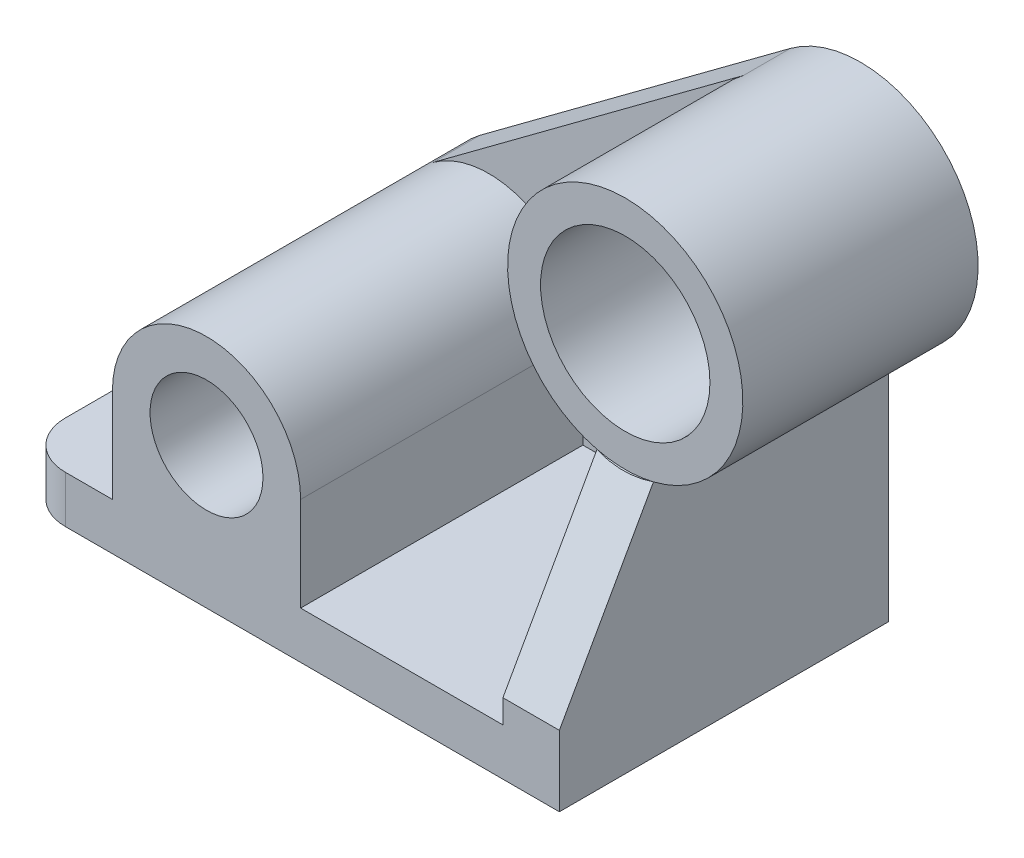
ISO-10303-21;
HEADER;
FILE_DESCRIPTION(('STEP AP214'),'2;1');
FILE_NAME('part.step','',(''),(''),'','','');
FILE_SCHEMA(('AUTOMOTIVE_DESIGN { 1 0 10303 214 1 1 1 1 }'));
ENDSEC;
DATA;
#1=APPLICATION_CONTEXT('core data for automotive mechanical design processes');
#2=APPLICATION_PROTOCOL_DEFINITION('international standard','automotive_design',2000,#1);
#3=PRODUCT_CONTEXT('',#1,'mechanical');
#4=PRODUCT('Part','Part','',(#3));
#5=PRODUCT_RELATED_PRODUCT_CATEGORY('part','',(#4));
#6=PRODUCT_DEFINITION_FORMATION('','',#4);
#7=PRODUCT_DEFINITION_CONTEXT('part definition',#1,'design');
#8=PRODUCT_DEFINITION('design','',#6,#7);
#9=PRODUCT_DEFINITION_SHAPE('','',#8);
#10=(LENGTH_UNIT() NAMED_UNIT(*) SI_UNIT(.MILLI.,.METRE.));
#11=(NAMED_UNIT(*) PLANE_ANGLE_UNIT() SI_UNIT($,.RADIAN.));
#12=(NAMED_UNIT(*) SI_UNIT($,.STERADIAN.) SOLID_ANGLE_UNIT());
#13=UNCERTAINTY_MEASURE_WITH_UNIT(LENGTH_MEASURE(1.E-05),#10,'distance_accuracy_value','');
#14=(GEOMETRIC_REPRESENTATION_CONTEXT(3) GLOBAL_UNCERTAINTY_ASSIGNED_CONTEXT((#13)) GLOBAL_UNIT_ASSIGNED_CONTEXT((#10,
#11,#12)) REPRESENTATION_CONTEXT('',''));
#15=CARTESIAN_POINT('',(0.,0.,0.));
#16=DIRECTION('',(0.,0.,1.));
#17=DIRECTION('',(1.,0.,0.));
#18=AXIS2_PLACEMENT_3D('',#15,#16,#17);
#19=CARTESIAN_POINT('',(41.0531732418524,48.5758064516129,35.));
#20=DIRECTION('',(0.,0.,-1.));
#21=DIRECTION('',(-1.,0.,0.));
#22=AXIS2_PLACEMENT_3D('',#19,#20,#21);
#23=CYLINDRICAL_SURFACE('',#22,25.);
#24=CARTESIAN_POINT('',(41.0531732418524,48.5758064516129,15.));
#25=DIRECTION('',(0.,0.,1.));
#26=DIRECTION('',(1.,0.,0.));
#27=AXIS2_PLACEMENT_3D('',#24,#25,#26);
#28=CIRCLE('',#27,25.);
#29=CARTESIAN_POINT('',(47.0531732418524,24.3064842525897,15.));
#30=VERTEX_POINT('',#29);
#31=CARTESIAN_POINT('',(35.0531732418524,24.3064842525897,15.));
#32=VERTEX_POINT('',#31);
#33=EDGE_CURVE('E537',#30,#32,#28,.T.);
#34=ORIENTED_EDGE('',*,*,#33,.F.);
#35=DIRECTION('',(0.,0.,-1.));
#36=VECTOR('',#35,1.);
#37=CARTESIAN_POINT('',(47.0531732418524,24.3064842525897,35.));
#38=LINE('',#37,#36);
#39=CARTESIAN_POINT('',(47.0531732418524,24.3064842525897,-35.));
#40=VERTEX_POINT('',#39);
#41=EDGE_CURVE('E239',#30,#40,#38,.T.);
#42=ORIENTED_EDGE('',*,*,#41,.T.);
#43=CARTESIAN_POINT('',(41.0531732418524,48.5758064516129,-35.));
#44=DIRECTION('',(0.,0.,1.));
#45=DIRECTION('',(1.,0.,0.));
#46=AXIS2_PLACEMENT_3D('',#43,#44,#45);
#47=CIRCLE('',#46,25.);
#48=CARTESIAN_POINT('',(26.1506588338031,68.6485507661774,-35.));
#49=VERTEX_POINT('',#48);
#50=EDGE_CURVE('E299',#40,#49,#47,.T.);
#51=ORIENTED_EDGE('',*,*,#50,.T.);
#52=DIRECTION('',(0.,0.,-1.));
#53=VECTOR('',#52,1.);
#54=CARTESIAN_POINT('',(26.1506588338031,68.6485507661774,-25.));
#55=LINE('',#54,#53);
#56=CARTESIAN_POINT('',(26.1506588338031,68.6485507661774,-25.));
#57=VERTEX_POINT('',#56);
#58=EDGE_CURVE('E562',#57,#49,#55,.T.);
#59=ORIENTED_EDGE('',*,*,#58,.F.);
#60=CARTESIAN_POINT('',(41.0531732418524,48.5758064516129,-25.));
#61=DIRECTION('',(0.,0.,-1.));
#62=DIRECTION('',(-1.,0.,0.));
#63=AXIS2_PLACEMENT_3D('',#60,#61,#62);
#64=CIRCLE('',#63,25.);
#65=CARTESIAN_POINT('',(35.0531732418524,24.3064842525897,-25.));
#66=VERTEX_POINT('',#65);
#67=EDGE_CURVE('E547',#66,#57,#64,.T.);
#68=ORIENTED_EDGE('',*,*,#67,.F.);
#69=DIRECTION('',(0.,0.,-1.));
#70=VECTOR('',#69,1.);
#71=CARTESIAN_POINT('',(35.0531732418524,24.3064842525897,35.));
#72=LINE('',#71,#70);
#73=EDGE_CURVE('E278',#32,#66,#72,.T.);
#74=ORIENTED_EDGE('',*,*,#73,.F.);
#75=EDGE_LOOP('',(#34,#42,#51,#59,#68,#74));
#76=FACE_BOUND('',#75,.T.);
#77=ADVANCED_FACE('F122',(#76),#23,.T.);
#78=CARTESIAN_POINT('',(41.0531732418524,48.5758064516129,35.));
#79=DIRECTION('',(0.,0.,-1.));
#80=DIRECTION('',(-1.,0.,0.));
#81=AXIS2_PLACEMENT_3D('',#78,#79,#80);
#82=CYLINDRICAL_SURFACE('',#81,18.);
#83=CARTESIAN_POINT('',(41.0531732418524,48.5758064516129,-35.));
#84=DIRECTION('',(0.,0.,1.));
#85=DIRECTION('',(1.,0.,0.));
#86=AXIS2_PLACEMENT_3D('',#83,#84,#85);
#87=CIRCLE('',#86,18.);
#88=CARTESIAN_POINT('',(59.0531732418524,48.5758064516129,-35.));
#89=VERTEX_POINT('',#88);
#90=EDGE_CURVE('E296',#89,#89,#87,.T.);
#91=ORIENTED_EDGE('',*,*,#90,.F.);
#92=EDGE_LOOP('',(#91));
#93=FACE_BOUND('',#92,.T.);
#94=CARTESIAN_POINT('',(41.0531732418524,48.5758064516129,15.));
#95=DIRECTION('',(0.,0.,1.));
#96=DIRECTION('',(1.,0.,0.));
#97=AXIS2_PLACEMENT_3D('',#94,#95,#96);
#98=CIRCLE('',#97,18.);
#99=CARTESIAN_POINT('',(59.0531732418524,48.5758064516129,15.));
#100=VERTEX_POINT('',#99);
#101=EDGE_CURVE('E535',#100,#100,#98,.F.);
#102=ORIENTED_EDGE('',*,*,#101,.F.);
#103=EDGE_LOOP('',(#102));
#104=FACE_BOUND('',#103,.T.);
#105=ADVANCED_FACE('F339',(#93,#104),#82,.F.);
#106=CARTESIAN_POINT('',(-7.94682675814757,0.,35.));
#107=DIRECTION('',(1.,0.,0.));
#108=DIRECTION('',(0.,0.,-1.));
#109=AXIS2_PLACEMENT_3D('',#106,#107,#108);
#110=PLANE('',#109);
#111=DIRECTION('',(0.,0.,-1.));
#112=VECTOR('',#111,1.);
#113=CARTESIAN_POINT('',(-7.94682675814757,-16.4241935483871,35.));
#114=LINE('',#113,#112);
#115=CARTESIAN_POINT('',(-7.94682675814757,-16.4241935483871,35.));
#116=VERTEX_POINT('',#115);
#117=CARTESIAN_POINT('',(-7.94682675814757,-16.4241935483871,-25.));
#118=VERTEX_POINT('',#117);
#119=EDGE_CURVE('E254',#116,#118,#114,.T.);
#120=ORIENTED_EDGE('',*,*,#119,.T.);
#121=DIRECTION('',(0.,-1.,0.));
#122=VECTOR('',#121,1.);
#123=CARTESIAN_POINT('',(-7.94682675814757,0.,-25.));
#124=LINE('',#123,#122);
#125=CARTESIAN_POINT('',(-7.94682675814757,3.57580645161291,-25.));
#126=VERTEX_POINT('',#125);
#127=EDGE_CURVE('E556',#126,#118,#124,.T.);
#128=ORIENTED_EDGE('',*,*,#127,.F.);
#129=DIRECTION('',(0.,0.,-1.));
#130=VECTOR('',#129,1.);
#131=CARTESIAN_POINT('',(-7.94682675814757,3.57580645161291,35.));
#132=LINE('',#131,#130);
#133=CARTESIAN_POINT('',(-7.94682675814757,3.57580645161291,35.));
#134=VERTEX_POINT('',#133);
#135=EDGE_CURVE('E292',#134,#126,#132,.T.);
#136=ORIENTED_EDGE('',*,*,#135,.F.);
#137=DIRECTION('',(0.,-1.,0.));
#138=VECTOR('',#137,1.);
#139=CARTESIAN_POINT('',(-7.94682675814757,0.,35.));
#140=LINE('',#139,#138);
#141=EDGE_CURVE('E272',#134,#116,#140,.T.);
#142=ORIENTED_EDGE('',*,*,#141,.T.);
#143=EDGE_LOOP('',(#120,#128,#136,#142));
#144=FACE_BOUND('',#143,.T.);
#145=ADVANCED_FACE('F344',(#144),#110,.T.);
#146=CARTESIAN_POINT('',(0.,-16.4241935483871,35.));
#147=DIRECTION('',(0.,1.,0.));
#148=DIRECTION('',(0.,0.,1.));
#149=AXIS2_PLACEMENT_3D('',#146,#147,#148);
#150=PLANE('',#149);
#151=DIRECTION('',(0.,0.,-1.));
#152=VECTOR('',#151,1.);
#153=CARTESIAN_POINT('',(35.0531732418524,-16.4241935483871,35.));
#154=LINE('',#153,#152);
#155=CARTESIAN_POINT('',(35.0531732418524,-16.4241935483871,35.));
#156=VERTEX_POINT('',#155);
#157=CARTESIAN_POINT('',(35.0531732418524,-16.4241935483871,-25.));
#158=VERTEX_POINT('',#157);
#159=EDGE_CURVE('E275',#156,#158,#154,.T.);
#160=ORIENTED_EDGE('',*,*,#159,.T.);
#161=DIRECTION('',(1.,0.,0.));
#162=VECTOR('',#161,1.);
#163=CARTESIAN_POINT('',(0.,-16.4241935483871,-25.));
#164=LINE('',#163,#162);
#165=EDGE_CURVE('E553',#118,#158,#164,.T.);
#166=ORIENTED_EDGE('',*,*,#165,.F.);
#167=ORIENTED_EDGE('',*,*,#119,.F.);
#168=DIRECTION('',(1.,0.,0.));
#169=VECTOR('',#168,1.);
#170=CARTESIAN_POINT('',(0.,-16.4241935483871,35.));
#171=LINE('',#170,#169);
#172=EDGE_CURVE('E246',#116,#156,#171,.T.);
#173=ORIENTED_EDGE('',*,*,#172,.T.);
#174=EDGE_LOOP('',(#160,#166,#167,#173));
#175=FACE_BOUND('',#174,.T.);
#176=ADVANCED_FACE('F351',(#175),#150,.T.);
#177=CARTESIAN_POINT('',(35.0531732418524,0.,35.));
#178=DIRECTION('',(-1.,0.,0.));
#179=DIRECTION('',(0.,0.,1.));
#180=AXIS2_PLACEMENT_3D('',#177,#178,#179);
#181=PLANE('',#180);
#182=DIRECTION('',(0.,-0.872601569326431,0.488432698750862));
#183=VECTOR('',#182,1.);
#184=CARTESIAN_POINT('',(35.0531732418524,-2.72542988397371,30.1309271473291));
#185=LINE('',#184,#183);
#186=CARTESIAN_POINT('',(35.0531732418524,-11.4241935483871,35.));
#187=VERTEX_POINT('',#186);
#188=EDGE_CURVE('E227',#32,#187,#185,.T.);
#189=ORIENTED_EDGE('',*,*,#188,.F.);
#190=ORIENTED_EDGE('',*,*,#73,.T.);
#191=DIRECTION('',(0.,1.,0.));
#192=VECTOR('',#191,1.);
#193=CARTESIAN_POINT('',(35.0531732418524,0.,-25.));
#194=LINE('',#193,#192);
#195=EDGE_CURVE('E550',#158,#66,#194,.T.);
#196=ORIENTED_EDGE('',*,*,#195,.F.);
#197=ORIENTED_EDGE('',*,*,#159,.F.);
#198=DIRECTION('',(0.,1.,0.));
#199=VECTOR('',#198,1.);
#200=CARTESIAN_POINT('',(35.0531732418524,0.,35.));
#201=LINE('',#200,#199);
#202=EDGE_CURVE('E244',#156,#187,#201,.T.);
#203=ORIENTED_EDGE('',*,*,#202,.T.);
#204=EDGE_LOOP('',(#189,#190,#196,#197,#203));
#205=FACE_BOUND('',#204,.T.);
#206=ADVANCED_FACE('F370',(#205),#181,.T.);
#207=CARTESIAN_POINT('',(-27.9468267581476,3.57580645161291,35.));
#208=DIRECTION('',(0.,0.,-1.));
#209=DIRECTION('',(-1.,0.,0.));
#210=AXIS2_PLACEMENT_3D('',#207,#208,#209);
#211=CYLINDRICAL_SURFACE('',#210,12.);
#212=CARTESIAN_POINT('',(-27.9468267581476,3.57580645161291,35.));
#213=DIRECTION('',(0.,0.,1.));
#214=DIRECTION('',(1.,0.,0.));
#215=AXIS2_PLACEMENT_3D('',#212,#213,#214);
#216=CIRCLE('',#215,12.);
#217=CARTESIAN_POINT('',(-15.9468267581476,3.57580645161291,35.));
#218=VERTEX_POINT('',#217);
#219=EDGE_CURVE('E258',#218,#218,#216,.T.);
#220=ORIENTED_EDGE('',*,*,#219,.T.);
#221=EDGE_LOOP('',(#220));
#222=FACE_BOUND('',#221,.T.);
#223=CARTESIAN_POINT('',(-27.9468267581476,3.57580645161291,-35.));
#224=DIRECTION('',(0.,0.,1.));
#225=DIRECTION('',(1.,0.,0.));
#226=AXIS2_PLACEMENT_3D('',#223,#224,#225);
#227=CIRCLE('',#226,12.);
#228=CARTESIAN_POINT('',(-15.9468267581476,3.57580645161291,-35.));
#229=VERTEX_POINT('',#228);
#230=EDGE_CURVE('E302',#229,#229,#227,.T.);
#231=ORIENTED_EDGE('',*,*,#230,.F.);
#232=EDGE_LOOP('',(#231));
#233=FACE_BOUND('',#232,.T.);
#234=ADVANCED_FACE('F357',(#222,#233),#211,.F.);
#235=CARTESIAN_POINT('',(-27.9468267581476,3.57580645161291,35.));
#236=DIRECTION('',(0.,0.,-1.));
#237=DIRECTION('',(-1.,0.,0.));
#238=AXIS2_PLACEMENT_3D('',#235,#236,#237);
#239=CYLINDRICAL_SURFACE('',#238,20.);
#240=CARTESIAN_POINT('',(-27.9468267581476,3.57580645161291,-25.));
#241=DIRECTION('',(0.,0.,-1.));
#242=DIRECTION('',(-1.,0.,0.));
#243=AXIS2_PLACEMENT_3D('',#240,#241,#242);
#244=CIRCLE('',#243,20.);
#245=CARTESIAN_POINT('',(-39.868838284587,19.6340019032645,-25.));
#246=VERTEX_POINT('',#245);
#247=EDGE_CURVE('E559',#246,#126,#244,.T.);
#248=ORIENTED_EDGE('',*,*,#247,.F.);
#249=DIRECTION('',(0.,0.,-1.));
#250=VECTOR('',#249,1.);
#251=CARTESIAN_POINT('',(-39.868838284587,19.6340019032645,-25.));
#252=LINE('',#251,#250);
#253=CARTESIAN_POINT('',(-39.868838284587,19.6340019032645,-35.));
#254=VERTEX_POINT('',#253);
#255=EDGE_CURVE('E300',#246,#254,#252,.T.);
#256=ORIENTED_EDGE('',*,*,#255,.T.);
#257=CARTESIAN_POINT('',(-27.9468267581476,3.57580645161291,-35.));
#258=DIRECTION('',(0.,0.,1.));
#259=DIRECTION('',(1.,0.,0.));
#260=AXIS2_PLACEMENT_3D('',#257,#258,#259);
#261=CIRCLE('',#260,20.);
#262=CARTESIAN_POINT('',(-47.9468267581476,3.57580645161291,-35.));
#263=VERTEX_POINT('',#262);
#264=EDGE_CURVE('E255',#254,#263,#261,.T.);
#265=ORIENTED_EDGE('',*,*,#264,.T.);
#266=DIRECTION('',(0.,0.,-1.));
#267=VECTOR('',#266,1.);
#268=CARTESIAN_POINT('',(-47.9468267581476,3.57580645161291,35.));
#269=LINE('',#268,#267);
#270=CARTESIAN_POINT('',(-47.9468267581476,3.57580645161291,35.));
#271=VERTEX_POINT('',#270);
#272=EDGE_CURVE('E289',#271,#263,#269,.T.);
#273=ORIENTED_EDGE('',*,*,#272,.F.);
#274=CARTESIAN_POINT('',(-27.9468267581476,3.57580645161291,35.));
#275=DIRECTION('',(0.,0.,1.));
#276=DIRECTION('',(1.,0.,0.));
#277=AXIS2_PLACEMENT_3D('',#274,#275,#276);
#278=CIRCLE('',#277,20.);
#279=EDGE_CURVE('E574',#134,#271,#278,.T.);
#280=ORIENTED_EDGE('',*,*,#279,.F.);
#281=ORIENTED_EDGE('',*,*,#135,.T.);
#282=EDGE_LOOP('',(#248,#256,#265,#273,#280,#281));
#283=FACE_BOUND('',#282,.T.);
#284=ADVANCED_FACE('F353',(#283),#239,.T.);
#285=CARTESIAN_POINT('',(-47.9468267581476,0.,35.));
#286=DIRECTION('',(1.,0.,0.));
#287=DIRECTION('',(0.,0.,-1.));
#288=AXIS2_PLACEMENT_3D('',#285,#286,#287);
#289=PLANE('',#288);
#290=DIRECTION('',(0.,-1.,0.));
#291=VECTOR('',#290,1.);
#292=CARTESIAN_POINT('',(-47.9468267581476,0.,-35.));
#293=LINE('',#292,#291);
#294=CARTESIAN_POINT('',(-47.9468267581476,-16.4241935483871,-35.));
#295=VERTEX_POINT('',#294);
#296=EDGE_CURVE('E257',#263,#295,#293,.T.);
#297=ORIENTED_EDGE('',*,*,#296,.T.);
#298=DIRECTION('',(0.,0.,-1.));
#299=VECTOR('',#298,1.);
#300=CARTESIAN_POINT('',(-47.9468267581476,-16.4241935483871,35.));
#301=LINE('',#300,#299);
#302=CARTESIAN_POINT('',(-47.9468267581476,-16.4241935483871,35.));
#303=VERTEX_POINT('',#302);
#304=EDGE_CURVE('E287',#303,#295,#301,.T.);
#305=ORIENTED_EDGE('',*,*,#304,.F.);
#306=DIRECTION('',(0.,-1.,0.));
#307=VECTOR('',#306,1.);
#308=CARTESIAN_POINT('',(-47.9468267581476,0.,35.));
#309=LINE('',#308,#307);
#310=EDGE_CURVE('E576',#271,#303,#309,.T.);
#311=ORIENTED_EDGE('',*,*,#310,.F.);
#312=ORIENTED_EDGE('',*,*,#272,.T.);
#313=EDGE_LOOP('',(#297,#305,#311,#312));
#314=FACE_BOUND('',#313,.T.);
#315=ADVANCED_FACE('F356',(#314),#289,.F.);
#316=CARTESIAN_POINT('',(0.,-16.4241935483871,35.));
#317=DIRECTION('',(0.,1.,0.));
#318=DIRECTION('',(0.,0.,1.));
#319=AXIS2_PLACEMENT_3D('',#316,#317,#318);
#320=PLANE('',#319);
#321=DIRECTION('',(0.,0.,-1.));
#322=VECTOR('',#321,1.);
#323=CARTESIAN_POINT('',(-67.9468267581476,-16.4241935483871,35.));
#324=LINE('',#323,#322);
#325=CARTESIAN_POINT('',(-67.9468267581476,-16.4241935483871,25.));
#326=VERTEX_POINT('',#325);
#327=CARTESIAN_POINT('',(-67.9468267581476,-16.4241935483871,-35.));
#328=VERTEX_POINT('',#327);
#329=EDGE_CURVE('E285',#326,#328,#324,.T.);
#330=ORIENTED_EDGE('',*,*,#329,.F.);
#331=CARTESIAN_POINT('',(-57.9468267581476,-16.4241935483871,25.));
#332=DIRECTION('',(0.,1.,0.));
#333=DIRECTION('',(0.,0.,1.));
#334=AXIS2_PLACEMENT_3D('',#331,#332,#333);
#335=CIRCLE('',#334,10.);
#336=CARTESIAN_POINT('',(-57.9468267581476,-16.4241935483871,35.));
#337=VERTEX_POINT('',#336);
#338=EDGE_CURVE('E144',#326,#337,#335,.T.);
#339=ORIENTED_EDGE('',*,*,#338,.T.);
#340=DIRECTION('',(1.,0.,0.));
#341=VECTOR('',#340,1.);
#342=CARTESIAN_POINT('',(0.,-16.4241935483871,35.));
#343=LINE('',#342,#341);
#344=EDGE_CURVE('E248',#337,#303,#343,.T.);
#345=ORIENTED_EDGE('',*,*,#344,.T.);
#346=ORIENTED_EDGE('',*,*,#304,.T.);
#347=DIRECTION('',(1.,0.,0.));
#348=VECTOR('',#347,1.);
#349=CARTESIAN_POINT('',(0.,-16.4241935483871,-35.));
#350=LINE('',#349,#348);
#351=EDGE_CURVE('E261',#328,#295,#350,.T.);
#352=ORIENTED_EDGE('',*,*,#351,.F.);
#353=EDGE_LOOP('',(#330,#339,#345,#346,#352));
#354=FACE_BOUND('',#353,.T.);
#355=ADVANCED_FACE('F313',(#354),#320,.T.);
#356=CARTESIAN_POINT('',(-67.9468267581476,0.,35.));
#357=DIRECTION('',(-1.,0.,0.));
#358=DIRECTION('',(0.,0.,1.));
#359=AXIS2_PLACEMENT_3D('',#356,#357,#358);
#360=PLANE('',#359);
#361=DIRECTION('',(0.,0.,-1.));
#362=VECTOR('',#361,1.);
#363=CARTESIAN_POINT('',(-67.9468267581476,-26.4241935483871,35.));
#364=LINE('',#363,#362);
#365=CARTESIAN_POINT('',(-67.9468267581476,-26.4241935483871,25.));
#366=VERTEX_POINT('',#365);
#367=CARTESIAN_POINT('',(-67.9468267581476,-26.4241935483871,-35.));
#368=VERTEX_POINT('',#367);
#369=EDGE_CURVE('E283',#366,#368,#364,.T.);
#370=ORIENTED_EDGE('',*,*,#369,.F.);
#371=DIRECTION('',(0.,1.,0.));
#372=VECTOR('',#371,1.);
#373=CARTESIAN_POINT('',(-67.9468267581476,0.,25.));
#374=LINE('',#373,#372);
#375=EDGE_CURVE('E295',#366,#326,#374,.T.);
#376=ORIENTED_EDGE('',*,*,#375,.T.);
#377=ORIENTED_EDGE('',*,*,#329,.T.);
#378=DIRECTION('',(0.,1.,0.));
#379=VECTOR('',#378,1.);
#380=CARTESIAN_POINT('',(-67.9468267581476,0.,-35.));
#381=LINE('',#380,#379);
#382=EDGE_CURVE('E264',#368,#328,#381,.T.);
#383=ORIENTED_EDGE('',*,*,#382,.F.);
#384=EDGE_LOOP('',(#370,#376,#377,#383));
#385=FACE_BOUND('',#384,.T.);
#386=ADVANCED_FACE('F308',(#385),#360,.T.);
#387=CARTESIAN_POINT('',(0.,-26.4241935483871,35.));
#388=DIRECTION('',(0.,-1.,0.));
#389=DIRECTION('',(0.,0.,-1.));
#390=AXIS2_PLACEMENT_3D('',#387,#388,#389);
#391=PLANE('',#390);
#392=DIRECTION('',(-1.,0.,0.));
#393=VECTOR('',#392,1.);
#394=CARTESIAN_POINT('',(0.,-26.4241935483871,35.));
#395=LINE('',#394,#393);
#396=CARTESIAN_POINT('',(47.0531732418524,-26.4241935483871,35.));
#397=VERTEX_POINT('',#396);
#398=CARTESIAN_POINT('',(-57.9468267581476,-26.4241935483871,35.));
#399=VERTEX_POINT('',#398);
#400=EDGE_CURVE('E243',#397,#399,#395,.T.);
#401=ORIENTED_EDGE('',*,*,#400,.T.);
#402=CARTESIAN_POINT('',(-57.9468267581476,-26.4241935483871,25.));
#403=DIRECTION('',(0.,-1.,0.));
#404=DIRECTION('',(0.,0.,-1.));
#405=AXIS2_PLACEMENT_3D('',#402,#403,#404);
#406=CIRCLE('',#405,10.);
#407=EDGE_CURVE('E12',#399,#366,#406,.T.);
#408=ORIENTED_EDGE('',*,*,#407,.T.);
#409=ORIENTED_EDGE('',*,*,#369,.T.);
#410=DIRECTION('',(-1.,0.,0.));
#411=VECTOR('',#410,1.);
#412=CARTESIAN_POINT('',(0.,-26.4241935483871,-35.));
#413=LINE('',#412,#411);
#414=CARTESIAN_POINT('',(47.0531732418524,-26.4241935483871,-35.));
#415=VERTEX_POINT('',#414);
#416=EDGE_CURVE('E267',#415,#368,#413,.T.);
#417=ORIENTED_EDGE('',*,*,#416,.F.);
#418=DIRECTION('',(0.,0.,-1.));
#419=VECTOR('',#418,1.);
#420=CARTESIAN_POINT('',(47.0531732418524,-26.4241935483871,35.));
#421=LINE('',#420,#419);
#422=EDGE_CURVE('E281',#397,#415,#421,.T.);
#423=ORIENTED_EDGE('',*,*,#422,.F.);
#424=EDGE_LOOP('',(#401,#408,#409,#417,#423));
#425=FACE_BOUND('',#424,.T.);
#426=ADVANCED_FACE('F324',(#425),#391,.T.);
#427=CARTESIAN_POINT('',(47.0531732418524,0.,35.));
#428=DIRECTION('',(-1.,0.,0.));
#429=DIRECTION('',(0.,0.,1.));
#430=AXIS2_PLACEMENT_3D('',#427,#428,#429);
#431=PLANE('',#430);
#432=ORIENTED_EDGE('',*,*,#41,.F.);
#433=DIRECTION('',(0.,0.872601569326431,-0.488432698750862));
#434=VECTOR('',#433,1.);
#435=CARTESIAN_POINT('',(47.0531732418524,12.1918199964384,21.7810996050123));
#436=LINE('',#435,#434);
#437=CARTESIAN_POINT('',(47.0531732418524,-11.4241935483871,35.));
#438=VERTEX_POINT('',#437);
#439=EDGE_CURVE('E224',#438,#30,#436,.T.);
#440=ORIENTED_EDGE('',*,*,#439,.F.);
#441=DIRECTION('',(0.,1.,0.));
#442=VECTOR('',#441,1.);
#443=CARTESIAN_POINT('',(47.0531732418524,0.,35.));
#444=LINE('',#443,#442);
#445=EDGE_CURVE('E237',#397,#438,#444,.T.);
#446=ORIENTED_EDGE('',*,*,#445,.F.);
#447=ORIENTED_EDGE('',*,*,#422,.T.);
#448=DIRECTION('',(0.,1.,0.));
#449=VECTOR('',#448,1.);
#450=CARTESIAN_POINT('',(47.0531732418524,0.,-35.));
#451=LINE('',#450,#449);
#452=EDGE_CURVE('E270',#415,#40,#451,.T.);
#453=ORIENTED_EDGE('',*,*,#452,.T.);
#454=EDGE_LOOP('',(#432,#440,#446,#447,#453));
#455=FACE_BOUND('',#454,.T.);
#456=ADVANCED_FACE('F236',(#455),#431,.F.);
#457=CARTESIAN_POINT('',(0.,0.,35.));
#458=DIRECTION('',(0.,0.,1.));
#459=DIRECTION('',(1.,0.,0.));
#460=AXIS2_PLACEMENT_3D('',#457,#458,#459);
#461=PLANE('',#460);
#462=DIRECTION('',(1.,0.,0.));
#463=VECTOR('',#462,1.);
#464=CARTESIAN_POINT('',(27.0531732418524,-11.4241935483871,35.));
#465=LINE('',#464,#463);
#466=EDGE_CURVE('E221',#187,#438,#465,.T.);
#467=ORIENTED_EDGE('',*,*,#466,.F.);
#468=ORIENTED_EDGE('',*,*,#202,.F.);
#469=ORIENTED_EDGE('',*,*,#172,.F.);
#470=ORIENTED_EDGE('',*,*,#141,.F.);
#471=ORIENTED_EDGE('',*,*,#279,.T.);
#472=ORIENTED_EDGE('',*,*,#310,.T.);
#473=ORIENTED_EDGE('',*,*,#344,.F.);
#474=DIRECTION('',(0.,1.,0.));
#475=VECTOR('',#474,1.);
#476=CARTESIAN_POINT('',(-57.9468267581476,0.,35.));
#477=LINE('',#476,#475);
#478=EDGE_CURVE('E130',#337,#399,#477,.F.);
#479=ORIENTED_EDGE('',*,*,#478,.T.);
#480=ORIENTED_EDGE('',*,*,#400,.F.);
#481=ORIENTED_EDGE('',*,*,#445,.T.);
#482=EDGE_LOOP('',(#467,#468,#469,#470,#471,#472,#473,#479,#480,#481));
#483=FACE_BOUND('',#482,.T.);
#484=ORIENTED_EDGE('',*,*,#219,.F.);
#485=EDGE_LOOP('',(#484));
#486=FACE_BOUND('',#485,.T.);
#487=ADVANCED_FACE('F241',(#483,#486),#461,.T.);
#488=CARTESIAN_POINT('',(0.,0.,-35.));
#489=DIRECTION('',(0.,0.,1.));
#490=DIRECTION('',(1.,0.,0.));
#491=AXIS2_PLACEMENT_3D('',#488,#489,#490);
#492=PLANE('',#491);
#493=ORIENTED_EDGE('',*,*,#264,.F.);
#494=DIRECTION('',(-0.802909772582581,-0.596100576321973,0.));
#495=VECTOR('',#494,1.);
#496=CARTESIAN_POINT('',(-23.5639568101859,31.7391593887556,-35.));
#497=LINE('',#496,#495);
#498=EDGE_CURVE('E543',#49,#254,#497,.T.);
#499=ORIENTED_EDGE('',*,*,#498,.F.);
#500=ORIENTED_EDGE('',*,*,#50,.F.);
#501=ORIENTED_EDGE('',*,*,#452,.F.);
#502=ORIENTED_EDGE('',*,*,#416,.T.);
#503=ORIENTED_EDGE('',*,*,#382,.T.);
#504=ORIENTED_EDGE('',*,*,#351,.T.);
#505=ORIENTED_EDGE('',*,*,#296,.F.);
#506=EDGE_LOOP('',(#493,#499,#500,#501,#502,#503,#504,#505));
#507=FACE_BOUND('',#506,.T.);
#508=ORIENTED_EDGE('',*,*,#230,.T.);
#509=EDGE_LOOP('',(#508));
#510=FACE_BOUND('',#509,.T.);
#511=ORIENTED_EDGE('',*,*,#90,.T.);
#512=EDGE_LOOP('',(#511));
#513=FACE_BOUND('',#512,.T.);
#514=ADVANCED_FACE('F318',(#507,#510,#513),#492,.F.);
#515=CARTESIAN_POINT('',(-23.5639568101859,31.7391593887556,-25.));
#516=DIRECTION('',(0.596100576321973,-0.802909772582581,0.));
#517=DIRECTION('',(0.802909772582581,0.596100576321973,0.));
#518=AXIS2_PLACEMENT_3D('',#515,#516,#517);
#519=PLANE('',#518);
#520=ORIENTED_EDGE('',*,*,#498,.T.);
#521=ORIENTED_EDGE('',*,*,#255,.F.);
#522=DIRECTION('',(-0.802909772582581,-0.596100576321973,0.));
#523=VECTOR('',#522,1.);
#524=CARTESIAN_POINT('',(-23.5639568101859,31.7391593887556,-25.));
#525=LINE('',#524,#523);
#526=EDGE_CURVE('E544',#57,#246,#525,.T.);
#527=ORIENTED_EDGE('',*,*,#526,.F.);
#528=ORIENTED_EDGE('',*,*,#58,.T.);
#529=EDGE_LOOP('',(#520,#521,#527,#528));
#530=FACE_BOUND('',#529,.T.);
#531=ADVANCED_FACE('F335',(#530),#519,.F.);
#532=CARTESIAN_POINT('',(0.,0.,-25.));
#533=DIRECTION('',(0.,0.,-1.));
#534=DIRECTION('',(-1.,0.,0.));
#535=AXIS2_PLACEMENT_3D('',#532,#533,#534);
#536=PLANE('',#535);
#537=ORIENTED_EDGE('',*,*,#526,.T.);
#538=ORIENTED_EDGE('',*,*,#247,.T.);
#539=ORIENTED_EDGE('',*,*,#127,.T.);
#540=ORIENTED_EDGE('',*,*,#165,.T.);
#541=ORIENTED_EDGE('',*,*,#195,.T.);
#542=ORIENTED_EDGE('',*,*,#67,.T.);
#543=EDGE_LOOP('',(#537,#538,#539,#540,#541,#542));
#544=FACE_BOUND('',#543,.T.);
#545=ADVANCED_FACE('F327',(#544),#536,.F.);
#546=CARTESIAN_POINT('',(-57.9468267581476,0.,25.));
#547=DIRECTION('',(0.,1.,0.));
#548=DIRECTION('',(0.,0.,1.));
#549=AXIS2_PLACEMENT_3D('',#546,#547,#548);
#550=CYLINDRICAL_SURFACE('',#549,10.);
#551=ORIENTED_EDGE('',*,*,#407,.F.);
#552=ORIENTED_EDGE('',*,*,#478,.F.);
#553=ORIENTED_EDGE('',*,*,#338,.F.);
#554=ORIENTED_EDGE('',*,*,#375,.F.);
#555=EDGE_LOOP('',(#551,#552,#553,#554));
#556=FACE_BOUND('',#555,.T.);
#557=ADVANCED_FACE('F124',(#556),#550,.T.);
#558=CARTESIAN_POINT('',(41.0531732418524,48.5758064516129,15.));
#559=DIRECTION('',(0.,0.,1.));
#560=DIRECTION('',(1.,0.,0.));
#561=AXIS2_PLACEMENT_3D('',#558,#559,#560);
#562=CYLINDRICAL_SURFACE('',#561,25.);
#563=EDGE_CURVE('E532',#32,#30,#28,.T.);
#564=ORIENTED_EDGE('',*,*,#563,.F.);
#565=CARTESIAN_POINT('',(41.0531732418524,48.5758064516129,1.41541460019003));
#566=DIRECTION('',(0.,-0.488432698750862,-0.872601569326431));
#567=DIRECTION('',(0.,-0.872601569326431,0.488432698750862));
#568=AXIS2_PLACEMENT_3D('',#565,#566,#567);
#569=ELLIPSE('',#568,28.6499599345183,25.);
#570=EDGE_CURVE('E231',#32,#30,#569,.F.);
#571=ORIENTED_EDGE('',*,*,#570,.T.);
#572=EDGE_LOOP('',(#564,#571));
#573=FACE_BOUND('',#572,.T.);
#574=ADVANCED_FACE('F326',(#573),#562,.F.);
#575=CARTESIAN_POINT('',(0.,0.,15.));
#576=DIRECTION('',(0.,0.,1.));
#577=DIRECTION('',(1.,0.,0.));
#578=AXIS2_PLACEMENT_3D('',#575,#576,#577);
#579=PLANE('',#578);
#580=ORIENTED_EDGE('',*,*,#563,.T.);
#581=ORIENTED_EDGE('',*,*,#33,.T.);
#582=EDGE_LOOP('',(#580,#581));
#583=FACE_BOUND('',#582,.T.);
#584=ORIENTED_EDGE('',*,*,#101,.T.);
#585=EDGE_LOOP('',(#584));
#586=FACE_BOUND('',#585,.T.);
#587=ADVANCED_FACE('F332',(#583,#586),#579,.T.);
#588=CARTESIAN_POINT('',(27.0531732418524,12.1918199964384,21.7810996050123));
#589=DIRECTION('',(0.,-0.488432698750862,-0.872601569326431));
#590=DIRECTION('',(0.,0.872601569326431,-0.488432698750862));
#591=AXIS2_PLACEMENT_3D('',#588,#589,#590);
#592=PLANE('',#591);
#593=ORIENTED_EDGE('',*,*,#188,.T.);
#594=ORIENTED_EDGE('',*,*,#466,.T.);
#595=ORIENTED_EDGE('',*,*,#439,.T.);
#596=ORIENTED_EDGE('',*,*,#570,.F.);
#597=EDGE_LOOP('',(#593,#594,#595,#596));
#598=FACE_BOUND('',#597,.T.);
#599=ADVANCED_FACE('F223',(#598),#592,.F.);
#600=CLOSED_SHELL('',(#77,#105,#145,#176,#206,#234,#284,#315,#355,#386,#426,#456,#487,#514,#531,
#545,#557,#574,#587,#599));
#601=MANIFOLD_SOLID_BREP('B2',#600);
#602=ADVANCED_BREP_SHAPE_REPRESENTATION('',(#18,#601),#14);
#603=SHAPE_DEFINITION_REPRESENTATION(#9,#602);
ENDSEC;
END-ISO-10303-21;
